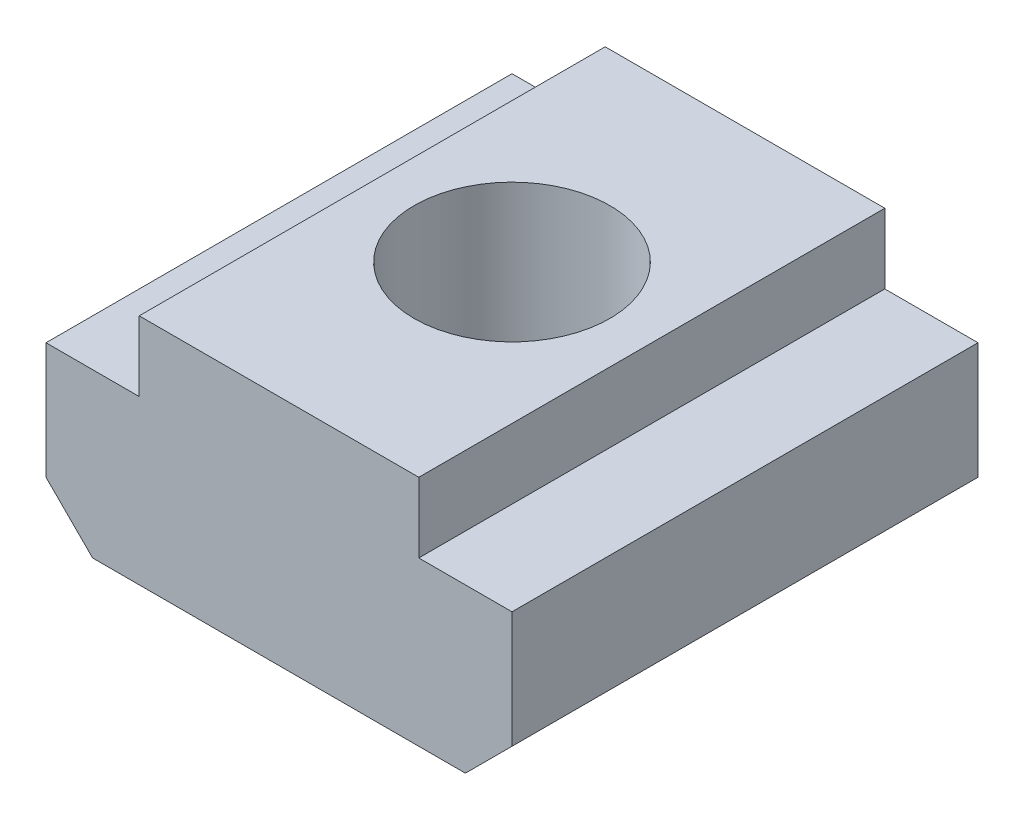
ISO-10303-21;
HEADER;
FILE_DESCRIPTION(('STEP AP214'),'2;1');
FILE_NAME('part.step','',(''),(''),'','','');
FILE_SCHEMA(('AUTOMOTIVE_DESIGN { 1 0 10303 214 1 1 1 1 }'));
ENDSEC;
DATA;
#1=APPLICATION_CONTEXT('core data for automotive mechanical design processes');
#2=APPLICATION_PROTOCOL_DEFINITION('international standard','automotive_design',2000,#1);
#3=PRODUCT_CONTEXT('',#1,'mechanical');
#4=PRODUCT('Part','Part','',(#3));
#5=PRODUCT_RELATED_PRODUCT_CATEGORY('part','',(#4));
#6=PRODUCT_DEFINITION_FORMATION('','',#4);
#7=PRODUCT_DEFINITION_CONTEXT('part definition',#1,'design');
#8=PRODUCT_DEFINITION('design','',#6,#7);
#9=PRODUCT_DEFINITION_SHAPE('','',#8);
#10=(LENGTH_UNIT() NAMED_UNIT(*) SI_UNIT(.MILLI.,.METRE.));
#11=(NAMED_UNIT(*) PLANE_ANGLE_UNIT() SI_UNIT($,.RADIAN.));
#12=(NAMED_UNIT(*) SI_UNIT($,.STERADIAN.) SOLID_ANGLE_UNIT());
#13=UNCERTAINTY_MEASURE_WITH_UNIT(LENGTH_MEASURE(1.E-05),#10,'distance_accuracy_value','');
#14=(GEOMETRIC_REPRESENTATION_CONTEXT(3) GLOBAL_UNCERTAINTY_ASSIGNED_CONTEXT((#13)) GLOBAL_UNIT_ASSIGNED_CONTEXT((#10,
#11,#12)) REPRESENTATION_CONTEXT('',''));
#15=CARTESIAN_POINT('',(0.,0.,0.));
#16=DIRECTION('',(0.,0.,1.));
#17=DIRECTION('',(1.,0.,0.));
#18=AXIS2_PLACEMENT_3D('',#15,#16,#17);
#19=CARTESIAN_POINT('',(-5.,1.,10.));
#20=DIRECTION('',(0.707106781186548,0.707106781186548,0.));
#21=DIRECTION('',(-0.707106781186548,0.707106781186548,0.));
#22=AXIS2_PLACEMENT_3D('',#19,#20,#21);
#23=PLANE('',#22);
#24=DIRECTION('',(0.707106781186548,-0.707106781186548,0.));
#25=VECTOR('',#24,1.);
#26=CARTESIAN_POINT('',(-5.,1.,0.));
#27=LINE('',#26,#25);
#28=CARTESIAN_POINT('',(-5.,1.,0.));
#29=VERTEX_POINT('',#28);
#30=CARTESIAN_POINT('',(-4.,0.,0.));
#31=VERTEX_POINT('',#30);
#32=EDGE_CURVE('E144',#29,#31,#27,.T.);
#33=ORIENTED_EDGE('',*,*,#32,.T.);
#34=DIRECTION('',(0.,0.,-1.));
#35=VECTOR('',#34,1.);
#36=CARTESIAN_POINT('',(-4.,0.,10.));
#37=LINE('',#36,#35);
#38=CARTESIAN_POINT('',(-4.,0.,10.));
#39=VERTEX_POINT('',#38);
#40=EDGE_CURVE('E11',#39,#31,#37,.T.);
#41=ORIENTED_EDGE('',*,*,#40,.F.);
#42=DIRECTION('',(0.707106781186548,-0.707106781186548,0.));
#43=VECTOR('',#42,1.);
#44=CARTESIAN_POINT('',(-5.,1.,10.));
#45=LINE('',#44,#43);
#46=CARTESIAN_POINT('',(-5.,1.,10.));
#47=VERTEX_POINT('',#46);
#48=EDGE_CURVE('E163',#47,#39,#45,.T.);
#49=ORIENTED_EDGE('',*,*,#48,.F.);
#50=DIRECTION('',(0.,0.,-1.));
#51=VECTOR('',#50,1.);
#52=CARTESIAN_POINT('',(-5.,1.,10.));
#53=LINE('',#52,#51);
#54=EDGE_CURVE('E140',#47,#29,#53,.T.);
#55=ORIENTED_EDGE('',*,*,#54,.T.);
#56=EDGE_LOOP('',(#33,#41,#49,#55));
#57=FACE_BOUND('',#56,.T.);
#58=ADVANCED_FACE('F36',(#57),#23,.F.);
#59=CARTESIAN_POINT('',(-4.,0.,10.));
#60=DIRECTION('',(0.,1.,0.));
#61=DIRECTION('',(0.,0.,1.));
#62=AXIS2_PLACEMENT_3D('',#59,#60,#61);
#63=PLANE('',#62);
#64=CARTESIAN_POINT('',(0.,0.,5.));
#65=DIRECTION('',(0.,1.,0.));
#66=DIRECTION('',(0.,0.,1.));
#67=AXIS2_PLACEMENT_3D('',#64,#65,#66);
#68=CIRCLE('',#67,2.1);
#69=CARTESIAN_POINT('',(0.,0.,7.1));
#70=VERTEX_POINT('',#69);
#71=EDGE_CURVE('E148',#70,#70,#68,.T.);
#72=ORIENTED_EDGE('',*,*,#71,.T.);
#73=EDGE_LOOP('',(#72));
#74=FACE_BOUND('',#73,.T.);
#75=DIRECTION('',(1.,0.,0.));
#76=VECTOR('',#75,1.);
#77=CARTESIAN_POINT('',(-4.,0.,0.));
#78=LINE('',#77,#76);
#79=CARTESIAN_POINT('',(4.,0.,0.));
#80=VERTEX_POINT('',#79);
#81=EDGE_CURVE('E147',#31,#80,#78,.T.);
#82=ORIENTED_EDGE('',*,*,#81,.T.);
#83=DIRECTION('',(0.,0.,-1.));
#84=VECTOR('',#83,1.);
#85=CARTESIAN_POINT('',(4.,0.,10.));
#86=LINE('',#85,#84);
#87=CARTESIAN_POINT('',(4.,0.,10.));
#88=VERTEX_POINT('',#87);
#89=EDGE_CURVE('E44',#88,#80,#86,.T.);
#90=ORIENTED_EDGE('',*,*,#89,.F.);
#91=DIRECTION('',(1.,0.,0.));
#92=VECTOR('',#91,1.);
#93=CARTESIAN_POINT('',(-4.,0.,10.));
#94=LINE('',#93,#92);
#95=EDGE_CURVE('E101',#39,#88,#94,.T.);
#96=ORIENTED_EDGE('',*,*,#95,.F.);
#97=ORIENTED_EDGE('',*,*,#40,.T.);
#98=EDGE_LOOP('',(#82,#90,#96,#97));
#99=FACE_BOUND('',#98,.T.);
#100=ADVANCED_FACE('F239',(#74,#99),#63,.F.);
#101=CARTESIAN_POINT('',(4.,0.,10.));
#102=DIRECTION('',(-0.707106781186548,0.707106781186548,0.));
#103=DIRECTION('',(-0.707106781186548,-0.707106781186548,0.));
#104=AXIS2_PLACEMENT_3D('',#101,#102,#103);
#105=PLANE('',#104);
#106=DIRECTION('',(0.707106781186548,0.707106781186548,0.));
#107=VECTOR('',#106,1.);
#108=CARTESIAN_POINT('',(4.,0.,0.));
#109=LINE('',#108,#107);
#110=CARTESIAN_POINT('',(5.,1.,0.));
#111=VERTEX_POINT('',#110);
#112=EDGE_CURVE('E150',#80,#111,#109,.T.);
#113=ORIENTED_EDGE('',*,*,#112,.T.);
#114=DIRECTION('',(0.,0.,-1.));
#115=VECTOR('',#114,1.);
#116=CARTESIAN_POINT('',(5.,1.,10.));
#117=LINE('',#116,#115);
#118=CARTESIAN_POINT('',(5.,1.,10.));
#119=VERTEX_POINT('',#118);
#120=EDGE_CURVE('E176',#119,#111,#117,.T.);
#121=ORIENTED_EDGE('',*,*,#120,.F.);
#122=DIRECTION('',(0.707106781186548,0.707106781186548,0.));
#123=VECTOR('',#122,1.);
#124=CARTESIAN_POINT('',(4.,0.,10.));
#125=LINE('',#124,#123);
#126=EDGE_CURVE('E184',#88,#119,#125,.T.);
#127=ORIENTED_EDGE('',*,*,#126,.F.);
#128=ORIENTED_EDGE('',*,*,#89,.T.);
#129=EDGE_LOOP('',(#113,#121,#127,#128));
#130=FACE_BOUND('',#129,.T.);
#131=ADVANCED_FACE('F182',(#130),#105,.F.);
#132=CARTESIAN_POINT('',(5.,1.,10.));
#133=DIRECTION('',(-1.,0.,0.));
#134=DIRECTION('',(0.,0.,1.));
#135=AXIS2_PLACEMENT_3D('',#132,#133,#134);
#136=PLANE('',#135);
#137=DIRECTION('',(0.,1.,0.));
#138=VECTOR('',#137,1.);
#139=CARTESIAN_POINT('',(5.,1.,0.));
#140=LINE('',#139,#138);
#141=CARTESIAN_POINT('',(5.,3.5,0.));
#142=VERTEX_POINT('',#141);
#143=EDGE_CURVE('E152',#111,#142,#140,.T.);
#144=ORIENTED_EDGE('',*,*,#143,.T.);
#145=DIRECTION('',(0.,0.,-1.));
#146=VECTOR('',#145,1.);
#147=CARTESIAN_POINT('',(5.,3.5,10.));
#148=LINE('',#147,#146);
#149=CARTESIAN_POINT('',(5.,3.5,10.));
#150=VERTEX_POINT('',#149);
#151=EDGE_CURVE('E173',#150,#142,#148,.T.);
#152=ORIENTED_EDGE('',*,*,#151,.F.);
#153=DIRECTION('',(0.,1.,0.));
#154=VECTOR('',#153,1.);
#155=CARTESIAN_POINT('',(5.,1.,10.));
#156=LINE('',#155,#154);
#157=EDGE_CURVE('E202',#119,#150,#156,.T.);
#158=ORIENTED_EDGE('',*,*,#157,.F.);
#159=ORIENTED_EDGE('',*,*,#120,.T.);
#160=EDGE_LOOP('',(#144,#152,#158,#159));
#161=FACE_BOUND('',#160,.T.);
#162=ADVANCED_FACE('F193',(#161),#136,.F.);
#163=CARTESIAN_POINT('',(5.,3.5,10.));
#164=DIRECTION('',(0.,-1.,0.));
#165=DIRECTION('',(1.,0.,0.));
#166=AXIS2_PLACEMENT_3D('',#163,#164,#165);
#167=PLANE('',#166);
#168=DIRECTION('',(-1.,0.,0.));
#169=VECTOR('',#168,1.);
#170=CARTESIAN_POINT('',(5.,3.5,0.));
#171=LINE('',#170,#169);
#172=CARTESIAN_POINT('',(3.,3.5,0.));
#173=VERTEX_POINT('',#172);
#174=EDGE_CURVE('E154',#142,#173,#171,.T.);
#175=ORIENTED_EDGE('',*,*,#174,.T.);
#176=DIRECTION('',(0.,0.,-1.));
#177=VECTOR('',#176,1.);
#178=CARTESIAN_POINT('',(3.,3.5,10.));
#179=LINE('',#178,#177);
#180=CARTESIAN_POINT('',(3.,3.5,10.));
#181=VERTEX_POINT('',#180);
#182=EDGE_CURVE('E170',#181,#173,#179,.T.);
#183=ORIENTED_EDGE('',*,*,#182,.F.);
#184=DIRECTION('',(-1.,0.,0.));
#185=VECTOR('',#184,1.);
#186=CARTESIAN_POINT('',(5.,3.5,10.));
#187=LINE('',#186,#185);
#188=EDGE_CURVE('E199',#150,#181,#187,.T.);
#189=ORIENTED_EDGE('',*,*,#188,.F.);
#190=ORIENTED_EDGE('',*,*,#151,.T.);
#191=EDGE_LOOP('',(#175,#183,#189,#190));
#192=FACE_BOUND('',#191,.T.);
#193=ADVANCED_FACE('F197',(#192),#167,.F.);
#194=CARTESIAN_POINT('',(3.,3.5,10.));
#195=DIRECTION('',(-1.,0.,0.));
#196=DIRECTION('',(0.,-1.,0.));
#197=AXIS2_PLACEMENT_3D('',#194,#195,#196);
#198=PLANE('',#197);
#199=DIRECTION('',(0.,1.,0.));
#200=VECTOR('',#199,1.);
#201=CARTESIAN_POINT('',(3.,3.5,0.));
#202=LINE('',#201,#200);
#203=CARTESIAN_POINT('',(3.,5.,0.));
#204=VERTEX_POINT('',#203);
#205=EDGE_CURVE('E156',#173,#204,#202,.T.);
#206=ORIENTED_EDGE('',*,*,#205,.T.);
#207=DIRECTION('',(0.,0.,-1.));
#208=VECTOR('',#207,1.);
#209=CARTESIAN_POINT('',(3.,5.,10.));
#210=LINE('',#209,#208);
#211=CARTESIAN_POINT('',(3.,5.,10.));
#212=VERTEX_POINT('',#211);
#213=EDGE_CURVE('E167',#212,#204,#210,.T.);
#214=ORIENTED_EDGE('',*,*,#213,.F.);
#215=DIRECTION('',(0.,1.,0.));
#216=VECTOR('',#215,1.);
#217=CARTESIAN_POINT('',(3.,3.5,10.));
#218=LINE('',#217,#216);
#219=EDGE_CURVE('E201',#181,#212,#218,.T.);
#220=ORIENTED_EDGE('',*,*,#219,.F.);
#221=ORIENTED_EDGE('',*,*,#182,.T.);
#222=EDGE_LOOP('',(#206,#214,#220,#221));
#223=FACE_BOUND('',#222,.T.);
#224=ADVANCED_FACE('F221',(#223),#198,.F.);
#225=CARTESIAN_POINT('',(3.,5.,10.));
#226=DIRECTION('',(0.,-1.,0.));
#227=DIRECTION('',(0.,0.,-1.));
#228=AXIS2_PLACEMENT_3D('',#225,#226,#227);
#229=PLANE('',#228);
#230=CARTESIAN_POINT('',(0.,5.,5.));
#231=DIRECTION('',(0.,1.,0.));
#232=DIRECTION('',(0.,0.,1.));
#233=AXIS2_PLACEMENT_3D('',#230,#231,#232);
#234=CIRCLE('',#233,2.1);
#235=CARTESIAN_POINT('',(0.,5.,7.1));
#236=VERTEX_POINT('',#235);
#237=EDGE_CURVE('E212',#236,#236,#234,.T.);
#238=ORIENTED_EDGE('',*,*,#237,.F.);
#239=EDGE_LOOP('',(#238));
#240=FACE_BOUND('',#239,.T.);
#241=DIRECTION('',(-1.,0.,0.));
#242=VECTOR('',#241,1.);
#243=CARTESIAN_POINT('',(3.,5.,0.));
#244=LINE('',#243,#242);
#245=CARTESIAN_POINT('',(-3.,5.,0.));
#246=VERTEX_POINT('',#245);
#247=EDGE_CURVE('E158',#204,#246,#244,.T.);
#248=ORIENTED_EDGE('',*,*,#247,.T.);
#249=DIRECTION('',(0.,0.,-1.));
#250=VECTOR('',#249,1.);
#251=CARTESIAN_POINT('',(-3.,5.,10.));
#252=LINE('',#251,#250);
#253=CARTESIAN_POINT('',(-3.,5.,10.));
#254=VERTEX_POINT('',#253);
#255=EDGE_CURVE('E135',#254,#246,#252,.T.);
#256=ORIENTED_EDGE('',*,*,#255,.F.);
#257=DIRECTION('',(-1.,0.,0.));
#258=VECTOR('',#257,1.);
#259=CARTESIAN_POINT('',(3.,5.,10.));
#260=LINE('',#259,#258);
#261=EDGE_CURVE('E126',#212,#254,#260,.T.);
#262=ORIENTED_EDGE('',*,*,#261,.F.);
#263=ORIENTED_EDGE('',*,*,#213,.T.);
#264=EDGE_LOOP('',(#248,#256,#262,#263));
#265=FACE_BOUND('',#264,.T.);
#266=ADVANCED_FACE('F218',(#240,#265),#229,.F.);
#267=CARTESIAN_POINT('',(-3.,5.,10.));
#268=DIRECTION('',(1.,0.,0.));
#269=DIRECTION('',(0.,1.,0.));
#270=AXIS2_PLACEMENT_3D('',#267,#268,#269);
#271=PLANE('',#270);
#272=DIRECTION('',(0.,-1.,0.));
#273=VECTOR('',#272,1.);
#274=CARTESIAN_POINT('',(-3.,5.,0.));
#275=LINE('',#274,#273);
#276=CARTESIAN_POINT('',(-3.,3.5,0.));
#277=VERTEX_POINT('',#276);
#278=EDGE_CURVE('E134',#246,#277,#275,.T.);
#279=ORIENTED_EDGE('',*,*,#278,.T.);
#280=DIRECTION('',(0.,0.,-1.));
#281=VECTOR('',#280,1.);
#282=CARTESIAN_POINT('',(-3.,3.5,10.));
#283=LINE('',#282,#281);
#284=CARTESIAN_POINT('',(-3.,3.5,10.));
#285=VERTEX_POINT('',#284);
#286=EDGE_CURVE('E131',#285,#277,#283,.T.);
#287=ORIENTED_EDGE('',*,*,#286,.F.);
#288=DIRECTION('',(0.,-1.,0.));
#289=VECTOR('',#288,1.);
#290=CARTESIAN_POINT('',(-3.,5.,10.));
#291=LINE('',#290,#289);
#292=EDGE_CURVE('E120',#254,#285,#291,.T.);
#293=ORIENTED_EDGE('',*,*,#292,.F.);
#294=ORIENTED_EDGE('',*,*,#255,.T.);
#295=EDGE_LOOP('',(#279,#287,#293,#294));
#296=FACE_BOUND('',#295,.T.);
#297=ADVANCED_FACE('F132',(#296),#271,.F.);
#298=CARTESIAN_POINT('',(-3.,3.5,10.));
#299=DIRECTION('',(0.,-1.,0.));
#300=DIRECTION('',(0.,0.,-1.));
#301=AXIS2_PLACEMENT_3D('',#298,#299,#300);
#302=PLANE('',#301);
#303=DIRECTION('',(-1.,0.,0.));
#304=VECTOR('',#303,1.);
#305=CARTESIAN_POINT('',(-3.,3.5,0.));
#306=LINE('',#305,#304);
#307=CARTESIAN_POINT('',(-5.,3.5,0.));
#308=VERTEX_POINT('',#307);
#309=EDGE_CURVE('E87',#277,#308,#306,.T.);
#310=ORIENTED_EDGE('',*,*,#309,.T.);
#311=DIRECTION('',(0.,0.,-1.));
#312=VECTOR('',#311,1.);
#313=CARTESIAN_POINT('',(-5.,3.5,10.));
#314=LINE('',#313,#312);
#315=CARTESIAN_POINT('',(-5.,3.5,10.));
#316=VERTEX_POINT('',#315);
#317=EDGE_CURVE('E136',#316,#308,#314,.T.);
#318=ORIENTED_EDGE('',*,*,#317,.F.);
#319=DIRECTION('',(-1.,0.,0.));
#320=VECTOR('',#319,1.);
#321=CARTESIAN_POINT('',(-3.,3.5,10.));
#322=LINE('',#321,#320);
#323=EDGE_CURVE('E124',#285,#316,#322,.T.);
#324=ORIENTED_EDGE('',*,*,#323,.F.);
#325=ORIENTED_EDGE('',*,*,#286,.T.);
#326=EDGE_LOOP('',(#310,#318,#324,#325));
#327=FACE_BOUND('',#326,.T.);
#328=ADVANCED_FACE('F138',(#327),#302,.F.);
#329=CARTESIAN_POINT('',(-5.,3.5,10.));
#330=DIRECTION('',(1.,0.,0.));
#331=DIRECTION('',(0.,1.,0.));
#332=AXIS2_PLACEMENT_3D('',#329,#330,#331);
#333=PLANE('',#332);
#334=DIRECTION('',(0.,-1.,0.));
#335=VECTOR('',#334,1.);
#336=CARTESIAN_POINT('',(-5.,3.5,0.));
#337=LINE('',#336,#335);
#338=EDGE_CURVE('E93',#308,#29,#337,.T.);
#339=ORIENTED_EDGE('',*,*,#338,.T.);
#340=ORIENTED_EDGE('',*,*,#54,.F.);
#341=DIRECTION('',(0.,-1.,0.));
#342=VECTOR('',#341,1.);
#343=CARTESIAN_POINT('',(-5.,3.5,10.));
#344=LINE('',#343,#342);
#345=EDGE_CURVE('E52',#316,#47,#344,.T.);
#346=ORIENTED_EDGE('',*,*,#345,.F.);
#347=ORIENTED_EDGE('',*,*,#317,.T.);
#348=EDGE_LOOP('',(#339,#340,#346,#347));
#349=FACE_BOUND('',#348,.T.);
#350=ADVANCED_FACE('F228',(#349),#333,.F.);
#351=CARTESIAN_POINT('',(0.,0.,10.));
#352=DIRECTION('',(0.,0.,1.));
#353=DIRECTION('',(1.,0.,0.));
#354=AXIS2_PLACEMENT_3D('',#351,#352,#353);
#355=PLANE('',#354);
#356=ORIENTED_EDGE('',*,*,#48,.T.);
#357=ORIENTED_EDGE('',*,*,#95,.T.);
#358=ORIENTED_EDGE('',*,*,#126,.T.);
#359=ORIENTED_EDGE('',*,*,#157,.T.);
#360=ORIENTED_EDGE('',*,*,#188,.T.);
#361=ORIENTED_EDGE('',*,*,#219,.T.);
#362=ORIENTED_EDGE('',*,*,#261,.T.);
#363=ORIENTED_EDGE('',*,*,#292,.T.);
#364=ORIENTED_EDGE('',*,*,#323,.T.);
#365=ORIENTED_EDGE('',*,*,#345,.T.);
#366=EDGE_LOOP('',(#356,#357,#358,#359,#360,#361,#362,#363,#364,#365));
#367=FACE_BOUND('',#366,.T.);
#368=ADVANCED_FACE('F122',(#367),#355,.T.);
#369=CARTESIAN_POINT('',(0.,0.,0.));
#370=DIRECTION('',(0.,0.,1.));
#371=DIRECTION('',(1.,0.,0.));
#372=AXIS2_PLACEMENT_3D('',#369,#370,#371);
#373=PLANE('',#372);
#374=ORIENTED_EDGE('',*,*,#32,.F.);
#375=ORIENTED_EDGE('',*,*,#338,.F.);
#376=ORIENTED_EDGE('',*,*,#309,.F.);
#377=ORIENTED_EDGE('',*,*,#278,.F.);
#378=ORIENTED_EDGE('',*,*,#247,.F.);
#379=ORIENTED_EDGE('',*,*,#205,.F.);
#380=ORIENTED_EDGE('',*,*,#174,.F.);
#381=ORIENTED_EDGE('',*,*,#143,.F.);
#382=ORIENTED_EDGE('',*,*,#112,.F.);
#383=ORIENTED_EDGE('',*,*,#81,.F.);
#384=EDGE_LOOP('',(#374,#375,#376,#377,#378,#379,#380,#381,#382,#383));
#385=FACE_BOUND('',#384,.T.);
#386=ADVANCED_FACE('F188',(#385),#373,.F.);
#387=CARTESIAN_POINT('',(0.,5.,5.));
#388=DIRECTION('',(0.,1.,0.));
#389=DIRECTION('',(0.,0.,1.));
#390=AXIS2_PLACEMENT_3D('',#387,#388,#389);
#391=CYLINDRICAL_SURFACE('',#390,2.1);
#392=ORIENTED_EDGE('',*,*,#71,.F.);
#393=EDGE_LOOP('',(#392));
#394=FACE_BOUND('',#393,.T.);
#395=ORIENTED_EDGE('',*,*,#237,.T.);
#396=EDGE_LOOP('',(#395));
#397=FACE_BOUND('',#396,.T.);
#398=ADVANCED_FACE('F216',(#394,#397),#391,.F.);
#399=CLOSED_SHELL('',(#58,#100,#131,#162,#193,#224,#266,#297,#328,#350,#368,#386,#398));
#400=MANIFOLD_SOLID_BREP('B2',#399);
#401=ADVANCED_BREP_SHAPE_REPRESENTATION('',(#18,#400),#14);
#402=SHAPE_DEFINITION_REPRESENTATION(#9,#401);
ENDSEC;
END-ISO-10303-21;
